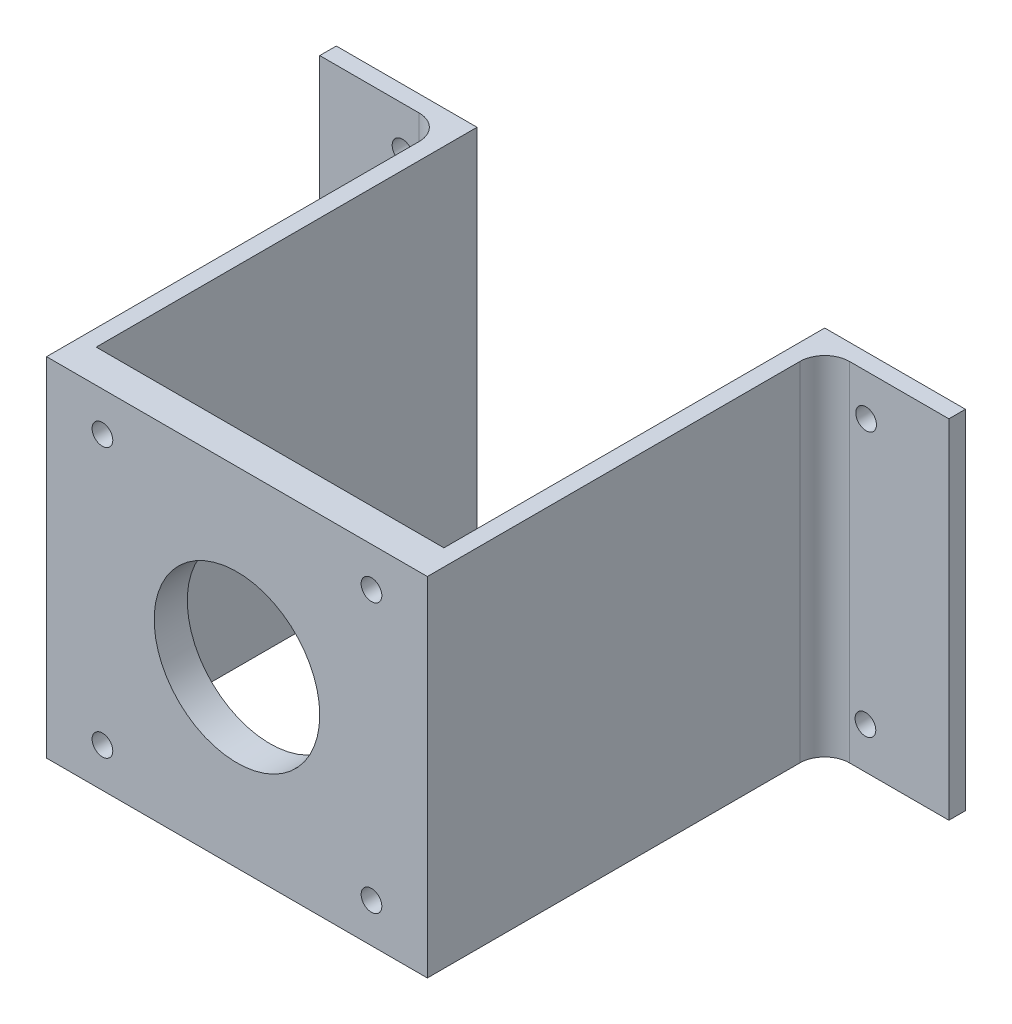
ISO-10303-21;
HEADER;
FILE_DESCRIPTION(('STEP AP214'),'2;1');
FILE_NAME('part.step','',(''),(''),'','','');
FILE_SCHEMA(('AUTOMOTIVE_DESIGN { 1 0 10303 214 1 1 1 1 }'));
ENDSEC;
DATA;
#1=APPLICATION_CONTEXT('core data for automotive mechanical design processes');
#2=APPLICATION_PROTOCOL_DEFINITION('international standard','automotive_design',2000,#1);
#3=PRODUCT_CONTEXT('',#1,'mechanical');
#4=PRODUCT('Part','Part','',(#3));
#5=PRODUCT_RELATED_PRODUCT_CATEGORY('part','',(#4));
#6=PRODUCT_DEFINITION_FORMATION('','',#4);
#7=PRODUCT_DEFINITION_CONTEXT('part definition',#1,'design');
#8=PRODUCT_DEFINITION('design','',#6,#7);
#9=PRODUCT_DEFINITION_SHAPE('','',#8);
#10=(LENGTH_UNIT() NAMED_UNIT(*) SI_UNIT(.MILLI.,.METRE.));
#11=(NAMED_UNIT(*) PLANE_ANGLE_UNIT() SI_UNIT($,.RADIAN.));
#12=(NAMED_UNIT(*) SI_UNIT($,.STERADIAN.) SOLID_ANGLE_UNIT());
#13=UNCERTAINTY_MEASURE_WITH_UNIT(LENGTH_MEASURE(1.E-05),#10,'distance_accuracy_value','');
#14=(GEOMETRIC_REPRESENTATION_CONTEXT(3) GLOBAL_UNCERTAINTY_ASSIGNED_CONTEXT((#13)) GLOBAL_UNIT_ASSIGNED_CONTEXT((#10,
#11,#12)) REPRESENTATION_CONTEXT('',''));
#15=CARTESIAN_POINT('',(0.,0.,0.));
#16=DIRECTION('',(0.,0.,1.));
#17=DIRECTION('',(1.,0.,0.));
#18=AXIS2_PLACEMENT_3D('',#15,#16,#17);
#19=CARTESIAN_POINT('',(-38.7497945939034,36.6203743665979,4.));
#20=DIRECTION('',(-1.,0.,0.));
#21=DIRECTION('',(0.,-1.,0.));
#22=AXIS2_PLACEMENT_3D('',#19,#20,#21);
#23=PLANE('',#22);
#24=DIRECTION('',(0.,0.,-1.));
#25=VECTOR('',#24,1.);
#26=CARTESIAN_POINT('',(-38.7497945939034,-5.37962563340208,4.));
#27=LINE('',#26,#25);
#28=CARTESIAN_POINT('',(-38.7497945939034,-5.37962563340208,4.));
#29=VERTEX_POINT('',#28);
#30=CARTESIAN_POINT('',(-38.7497945939034,-5.37962563340208,-41.));
#31=VERTEX_POINT('',#30);
#32=EDGE_CURVE('E268',#29,#31,#27,.T.);
#33=ORIENTED_EDGE('',*,*,#32,.T.);
#34=DIRECTION('',(0.,-1.,0.));
#35=VECTOR('',#34,1.);
#36=CARTESIAN_POINT('',(-38.7497945939034,36.6203743665979,-41.));
#37=LINE('',#36,#35);
#38=CARTESIAN_POINT('',(-38.7497945939034,36.6203743665979,-41.));
#39=VERTEX_POINT('',#38);
#40=EDGE_CURVE('E67',#31,#39,#37,.F.);
#41=ORIENTED_EDGE('',*,*,#40,.T.);
#42=DIRECTION('',(0.,0.,-1.));
#43=VECTOR('',#42,1.);
#44=CARTESIAN_POINT('',(-38.7497945939034,36.6203743665979,4.));
#45=LINE('',#44,#43);
#46=CARTESIAN_POINT('',(-38.7497945939034,36.6203743665979,4.));
#47=VERTEX_POINT('',#46);
#48=EDGE_CURVE('E285',#47,#39,#45,.T.);
#49=ORIENTED_EDGE('',*,*,#48,.F.);
#50=DIRECTION('',(0.,1.,0.));
#51=VECTOR('',#50,1.);
#52=CARTESIAN_POINT('',(-38.7497945939034,36.6203743665979,4.));
#53=LINE('',#52,#51);
#54=EDGE_CURVE('E254',#29,#47,#53,.T.);
#55=ORIENTED_EDGE('',*,*,#54,.F.);
#56=EDGE_LOOP('',(#33,#41,#49,#55));
#57=FACE_BOUND('',#56,.T.);
#58=ADVANCED_FACE('F45',(#57),#23,.F.);
#59=CARTESIAN_POINT('',(0.,0.,0.));
#60=DIRECTION('',(0.,0.,1.));
#61=DIRECTION('',(1.,0.,0.));
#62=AXIS2_PLACEMENT_3D('',#59,#60,#61);
#63=PLANE('',#62);
#64=CARTESIAN_POINT('',(-61.7497945939034,15.6203743665979,0.));
#65=DIRECTION('',(0.,0.,1.));
#66=DIRECTION('',(1.,0.,0.));
#67=AXIS2_PLACEMENT_3D('',#64,#65,#66);
#68=CIRCLE('',#67,10.);
#69=CARTESIAN_POINT('',(-51.7497945939034,15.6203743665979,0.));
#70=VERTEX_POINT('',#69);
#71=EDGE_CURVE('E442',#70,#70,#68,.T.);
#72=ORIENTED_EDGE('',*,*,#71,.T.);
#73=EDGE_LOOP('',(#72));
#74=FACE_BOUND('',#73,.T.);
#75=CARTESIAN_POINT('',(-45.4997945939034,-0.629625633402082,0.));
#76=DIRECTION('',(0.,0.,1.));
#77=DIRECTION('',(1.,0.,0.));
#78=AXIS2_PLACEMENT_3D('',#75,#76,#77);
#79=CIRCLE('',#78,1.25);
#80=CARTESIAN_POINT('',(-44.2497945939034,-0.629625633402082,0.));
#81=VERTEX_POINT('',#80);
#82=EDGE_CURVE('E469',#81,#81,#79,.T.);
#83=ORIENTED_EDGE('',*,*,#82,.T.);
#84=EDGE_LOOP('',(#83));
#85=FACE_BOUND('',#84,.T.);
#86=CARTESIAN_POINT('',(-45.4997945939034,31.8703743665979,0.));
#87=DIRECTION('',(0.,0.,1.));
#88=DIRECTION('',(1.,0.,0.));
#89=AXIS2_PLACEMENT_3D('',#86,#87,#88);
#90=CIRCLE('',#89,1.25);
#91=CARTESIAN_POINT('',(-44.2497945939034,31.8703743665979,0.));
#92=VERTEX_POINT('',#91);
#93=EDGE_CURVE('E175',#92,#92,#90,.T.);
#94=ORIENTED_EDGE('',*,*,#93,.T.);
#95=EDGE_LOOP('',(#94));
#96=FACE_BOUND('',#95,.T.);
#97=CARTESIAN_POINT('',(-77.9997945939034,-0.629625633402079,0.));
#98=DIRECTION('',(0.,0.,1.));
#99=DIRECTION('',(1.,0.,0.));
#100=AXIS2_PLACEMENT_3D('',#97,#98,#99);
#101=CIRCLE('',#100,1.25);
#102=CARTESIAN_POINT('',(-76.7497945939034,-0.629625633402079,0.));
#103=VERTEX_POINT('',#102);
#104=EDGE_CURVE('E179',#103,#103,#101,.T.);
#105=ORIENTED_EDGE('',*,*,#104,.T.);
#106=EDGE_LOOP('',(#105));
#107=FACE_BOUND('',#106,.T.);
#108=CARTESIAN_POINT('',(-77.9997945939034,31.8703743665979,0.));
#109=DIRECTION('',(0.,0.,1.));
#110=DIRECTION('',(1.,0.,0.));
#111=AXIS2_PLACEMENT_3D('',#108,#109,#110);
#112=CIRCLE('',#111,1.25);
#113=CARTESIAN_POINT('',(-76.7497945939034,31.8703743665979,0.));
#114=VERTEX_POINT('',#113);
#115=EDGE_CURVE('E478',#114,#114,#112,.T.);
#116=ORIENTED_EDGE('',*,*,#115,.T.);
#117=EDGE_LOOP('',(#116));
#118=FACE_BOUND('',#117,.T.);
#119=DIRECTION('',(0.,-1.,0.));
#120=VECTOR('',#119,1.);
#121=CARTESIAN_POINT('',(-82.7497945939034,36.6203743665979,0.));
#122=LINE('',#121,#120);
#123=CARTESIAN_POINT('',(-82.7497945939034,36.6203743665979,0.));
#124=VERTEX_POINT('',#123);
#125=CARTESIAN_POINT('',(-82.7497945939034,-5.37962563340208,0.));
#126=VERTEX_POINT('',#125);
#127=EDGE_CURVE('E222',#124,#126,#122,.T.);
#128=ORIENTED_EDGE('',*,*,#127,.F.);
#129=DIRECTION('',(-1.,0.,0.));
#130=VECTOR('',#129,1.);
#131=CARTESIAN_POINT('',(-84.7497945939034,36.6203743665979,0.));
#132=LINE('',#131,#130);
#133=CARTESIAN_POINT('',(-40.7497945939034,36.6203743665979,0.));
#134=VERTEX_POINT('',#133);
#135=EDGE_CURVE('E240',#134,#124,#132,.T.);
#136=ORIENTED_EDGE('',*,*,#135,.F.);
#137=DIRECTION('',(0.,1.,0.));
#138=VECTOR('',#137,1.);
#139=CARTESIAN_POINT('',(-40.7497945939034,36.6203743665979,0.));
#140=LINE('',#139,#138);
#141=CARTESIAN_POINT('',(-40.7497945939034,-5.37962563340208,0.));
#142=VERTEX_POINT('',#141);
#143=EDGE_CURVE('E232',#142,#134,#140,.T.);
#144=ORIENTED_EDGE('',*,*,#143,.F.);
#145=DIRECTION('',(1.,0.,0.));
#146=VECTOR('',#145,1.);
#147=CARTESIAN_POINT('',(-84.7497945939034,-5.37962563340208,0.));
#148=LINE('',#147,#146);
#149=EDGE_CURVE('E259',#126,#142,#148,.T.);
#150=ORIENTED_EDGE('',*,*,#149,.F.);
#151=EDGE_LOOP('',(#128,#136,#144,#150));
#152=FACE_BOUND('',#151,.T.);
#153=ADVANCED_FACE('F359',(#74,#85,#96,#107,#118,#152),#63,.F.);
#154=CARTESIAN_POINT('',(-84.7497945939034,36.6203743665979,4.));
#155=DIRECTION('',(0.,-1.,0.));
#156=DIRECTION('',(0.,0.,-1.));
#157=AXIS2_PLACEMENT_3D('',#154,#155,#156);
#158=PLANE('',#157);
#159=ORIENTED_EDGE('',*,*,#48,.T.);
#160=CARTESIAN_POINT('',(-35.7497945939034,36.6203743665979,-41.));
#161=DIRECTION('',(0.,-1.,0.));
#162=DIRECTION('',(0.,0.,-1.));
#163=AXIS2_PLACEMENT_3D('',#160,#161,#162);
#164=CIRCLE('',#163,3.);
#165=CARTESIAN_POINT('',(-35.7497945939034,36.6203743665979,-44.));
#166=VERTEX_POINT('',#165);
#167=EDGE_CURVE('E11',#39,#166,#164,.T.);
#168=ORIENTED_EDGE('',*,*,#167,.T.);
#169=DIRECTION('',(-1.,0.,0.));
#170=VECTOR('',#169,1.);
#171=CARTESIAN_POINT('',(-23.7497945939034,36.6203743665979,-44.));
#172=LINE('',#171,#170);
#173=CARTESIAN_POINT('',(-23.7497945939034,36.6203743665979,-44.));
#174=VERTEX_POINT('',#173);
#175=EDGE_CURVE('E164',#174,#166,#172,.T.);
#176=ORIENTED_EDGE('',*,*,#175,.F.);
#177=DIRECTION('',(0.,0.,1.));
#178=VECTOR('',#177,1.);
#179=CARTESIAN_POINT('',(-23.7497945939034,36.6203743665979,-46.));
#180=LINE('',#179,#178);
#181=CARTESIAN_POINT('',(-23.7497945939034,36.6203743665979,-46.));
#182=VERTEX_POINT('',#181);
#183=EDGE_CURVE('E161',#182,#174,#180,.T.);
#184=ORIENTED_EDGE('',*,*,#183,.F.);
#185=DIRECTION('',(1.,0.,0.));
#186=VECTOR('',#185,1.);
#187=CARTESIAN_POINT('',(-38.7497945939034,36.6203743665979,-46.));
#188=LINE('',#187,#186);
#189=CARTESIAN_POINT('',(-40.7497945939034,36.6203743665979,-46.));
#190=VERTEX_POINT('',#189);
#191=EDGE_CURVE('E147',#190,#182,#188,.T.);
#192=ORIENTED_EDGE('',*,*,#191,.F.);
#193=DIRECTION('',(0.,0.,1.));
#194=VECTOR('',#193,1.);
#195=CARTESIAN_POINT('',(-40.7497945939034,36.6203743665979,-46.));
#196=LINE('',#195,#194);
#197=EDGE_CURVE('E158',#190,#134,#196,.T.);
#198=ORIENTED_EDGE('',*,*,#197,.T.);
#199=ORIENTED_EDGE('',*,*,#135,.T.);
#200=DIRECTION('',(0.,0.,1.));
#201=VECTOR('',#200,1.);
#202=CARTESIAN_POINT('',(-82.7497945939034,36.6203743665979,-46.));
#203=LINE('',#202,#201);
#204=CARTESIAN_POINT('',(-82.7497945939034,36.6203743665979,-46.));
#205=VERTEX_POINT('',#204);
#206=EDGE_CURVE('E228',#205,#124,#203,.T.);
#207=ORIENTED_EDGE('',*,*,#206,.F.);
#208=DIRECTION('',(1.,0.,0.));
#209=VECTOR('',#208,1.);
#210=CARTESIAN_POINT('',(-82.7497945939034,36.6203743665979,-46.));
#211=LINE('',#210,#209);
#212=CARTESIAN_POINT('',(-99.7497945939034,36.6203743665979,-46.));
#213=VERTEX_POINT('',#212);
#214=EDGE_CURVE('E225',#213,#205,#211,.T.);
#215=ORIENTED_EDGE('',*,*,#214,.F.);
#216=DIRECTION('',(0.,0.,1.));
#217=VECTOR('',#216,1.);
#218=CARTESIAN_POINT('',(-99.7497945939034,36.6203743665979,-46.));
#219=LINE('',#218,#217);
#220=CARTESIAN_POINT('',(-99.7497945939034,36.6203743665979,-44.));
#221=VERTEX_POINT('',#220);
#222=EDGE_CURVE('E200',#213,#221,#219,.T.);
#223=ORIENTED_EDGE('',*,*,#222,.T.);
#224=DIRECTION('',(1.,0.,0.));
#225=VECTOR('',#224,1.);
#226=CARTESIAN_POINT('',(-99.7497945939034,36.6203743665979,-44.));
#227=LINE('',#226,#225);
#228=CARTESIAN_POINT('',(-87.7497945939034,36.6203743665979,-44.));
#229=VERTEX_POINT('',#228);
#230=EDGE_CURVE('E208',#221,#229,#227,.T.);
#231=ORIENTED_EDGE('',*,*,#230,.T.);
#232=CARTESIAN_POINT('',(-87.7497945939034,36.6203743665979,-41.));
#233=DIRECTION('',(0.,-1.,0.));
#234=DIRECTION('',(0.,0.,-1.));
#235=AXIS2_PLACEMENT_3D('',#232,#233,#234);
#236=CIRCLE('',#235,3.);
#237=CARTESIAN_POINT('',(-84.7497945939034,36.6203743665979,-41.));
#238=VERTEX_POINT('',#237);
#239=EDGE_CURVE('E298',#229,#238,#236,.T.);
#240=ORIENTED_EDGE('',*,*,#239,.T.);
#241=DIRECTION('',(0.,0.,-1.));
#242=VECTOR('',#241,1.);
#243=CARTESIAN_POINT('',(-84.7497945939034,36.6203743665979,4.));
#244=LINE('',#243,#242);
#245=CARTESIAN_POINT('',(-84.7497945939034,36.6203743665979,4.));
#246=VERTEX_POINT('',#245);
#247=EDGE_CURVE('E281',#246,#238,#244,.T.);
#248=ORIENTED_EDGE('',*,*,#247,.F.);
#249=DIRECTION('',(-1.,0.,0.));
#250=VECTOR('',#249,1.);
#251=CARTESIAN_POINT('',(-84.7497945939034,36.6203743665979,4.));
#252=LINE('',#251,#250);
#253=EDGE_CURVE('E258',#47,#246,#252,.T.);
#254=ORIENTED_EDGE('',*,*,#253,.F.);
#255=EDGE_LOOP('',(#159,#168,#176,#184,#192,#198,#199,#207,#215,#223,#231,#240,#248,#254));
#256=FACE_BOUND('',#255,.T.);
#257=ADVANCED_FACE('F162',(#256),#158,.F.);
#258=CARTESIAN_POINT('',(-84.7497945939034,36.6203743665979,4.));
#259=DIRECTION('',(1.,0.,0.));
#260=DIRECTION('',(0.,0.,-1.));
#261=AXIS2_PLACEMENT_3D('',#258,#259,#260);
#262=PLANE('',#261);
#263=ORIENTED_EDGE('',*,*,#247,.T.);
#264=DIRECTION('',(0.,-1.,0.));
#265=VECTOR('',#264,1.);
#266=CARTESIAN_POINT('',(-84.7497945939034,36.6203743665979,-41.));
#267=LINE('',#266,#265);
#268=CARTESIAN_POINT('',(-84.7497945939034,-5.37962563340208,-41.));
#269=VERTEX_POINT('',#268);
#270=EDGE_CURVE('E288',#238,#269,#267,.T.);
#271=ORIENTED_EDGE('',*,*,#270,.T.);
#272=DIRECTION('',(0.,0.,-1.));
#273=VECTOR('',#272,1.);
#274=CARTESIAN_POINT('',(-84.7497945939034,-5.37962563340208,4.));
#275=LINE('',#274,#273);
#276=CARTESIAN_POINT('',(-84.7497945939034,-5.37962563340208,4.));
#277=VERTEX_POINT('',#276);
#278=EDGE_CURVE('E277',#277,#269,#275,.T.);
#279=ORIENTED_EDGE('',*,*,#278,.F.);
#280=DIRECTION('',(0.,-1.,0.));
#281=VECTOR('',#280,1.);
#282=CARTESIAN_POINT('',(-84.7497945939034,36.6203743665979,4.));
#283=LINE('',#282,#281);
#284=EDGE_CURVE('E262',#246,#277,#283,.T.);
#285=ORIENTED_EDGE('',*,*,#284,.F.);
#286=EDGE_LOOP('',(#263,#271,#279,#285));
#287=FACE_BOUND('',#286,.T.);
#288=ADVANCED_FACE('F341',(#287),#262,.F.);
#289=CARTESIAN_POINT('',(-84.7497945939034,-5.37962563340208,4.));
#290=DIRECTION('',(0.,1.,0.));
#291=DIRECTION('',(0.,0.,1.));
#292=AXIS2_PLACEMENT_3D('',#289,#290,#291);
#293=PLANE('',#292);
#294=ORIENTED_EDGE('',*,*,#278,.T.);
#295=CARTESIAN_POINT('',(-87.7497945939034,-5.37962563340208,-41.));
#296=DIRECTION('',(0.,1.,0.));
#297=DIRECTION('',(0.,0.,1.));
#298=AXIS2_PLACEMENT_3D('',#295,#296,#297);
#299=CIRCLE('',#298,3.);
#300=CARTESIAN_POINT('',(-87.7497945939034,-5.37962563340208,-44.));
#301=VERTEX_POINT('',#300);
#302=EDGE_CURVE('E295',#269,#301,#299,.T.);
#303=ORIENTED_EDGE('',*,*,#302,.T.);
#304=DIRECTION('',(1.,0.,0.));
#305=VECTOR('',#304,1.);
#306=CARTESIAN_POINT('',(-99.7497945939034,-5.37962563340208,-44.));
#307=LINE('',#306,#305);
#308=CARTESIAN_POINT('',(-99.7497945939034,-5.37962563340208,-44.));
#309=VERTEX_POINT('',#308);
#310=EDGE_CURVE('E209',#309,#301,#307,.T.);
#311=ORIENTED_EDGE('',*,*,#310,.F.);
#312=DIRECTION('',(0.,0.,-1.));
#313=VECTOR('',#312,1.);
#314=CARTESIAN_POINT('',(-99.7497945939034,-5.37962563340208,-44.));
#315=LINE('',#314,#313);
#316=CARTESIAN_POINT('',(-99.7497945939034,-5.37962563340208,-46.));
#317=VERTEX_POINT('',#316);
#318=EDGE_CURVE('E192',#309,#317,#315,.T.);
#319=ORIENTED_EDGE('',*,*,#318,.T.);
#320=DIRECTION('',(-1.,0.,0.));
#321=VECTOR('',#320,1.);
#322=CARTESIAN_POINT('',(-82.7497945939034,-5.37962563340208,-46.));
#323=LINE('',#322,#321);
#324=CARTESIAN_POINT('',(-82.7497945939034,-5.37962563340208,-46.));
#325=VERTEX_POINT('',#324);
#326=EDGE_CURVE('E221',#325,#317,#323,.T.);
#327=ORIENTED_EDGE('',*,*,#326,.F.);
#328=DIRECTION('',(0.,0.,1.));
#329=VECTOR('',#328,1.);
#330=CARTESIAN_POINT('',(-82.7497945939034,-5.37962563340208,-46.));
#331=LINE('',#330,#329);
#332=EDGE_CURVE('E236',#325,#126,#331,.T.);
#333=ORIENTED_EDGE('',*,*,#332,.T.);
#334=ORIENTED_EDGE('',*,*,#149,.T.);
#335=DIRECTION('',(0.,0.,1.));
#336=VECTOR('',#335,1.);
#337=CARTESIAN_POINT('',(-40.7497945939034,-5.37962563340208,-46.));
#338=LINE('',#337,#336);
#339=CARTESIAN_POINT('',(-40.7497945939034,-5.37962563340208,-46.));
#340=VERTEX_POINT('',#339);
#341=EDGE_CURVE('E213',#340,#142,#338,.T.);
#342=ORIENTED_EDGE('',*,*,#341,.F.);
#343=DIRECTION('',(-1.,0.,0.));
#344=VECTOR('',#343,1.);
#345=CARTESIAN_POINT('',(-38.7497945939034,-5.37962563340208,-46.));
#346=LINE('',#345,#344);
#347=CARTESIAN_POINT('',(-23.7497945939034,-5.37962563340208,-46.));
#348=VERTEX_POINT('',#347);
#349=EDGE_CURVE('E248',#348,#340,#346,.T.);
#350=ORIENTED_EDGE('',*,*,#349,.F.);
#351=DIRECTION('',(0.,0.,-1.));
#352=VECTOR('',#351,1.);
#353=CARTESIAN_POINT('',(-23.7497945939034,-5.37962563340208,-44.));
#354=LINE('',#353,#352);
#355=CARTESIAN_POINT('',(-23.7497945939034,-5.37962563340208,-44.));
#356=VERTEX_POINT('',#355);
#357=EDGE_CURVE('E173',#356,#348,#354,.T.);
#358=ORIENTED_EDGE('',*,*,#357,.F.);
#359=DIRECTION('',(-1.,0.,0.));
#360=VECTOR('',#359,1.);
#361=CARTESIAN_POINT('',(-23.7497945939034,-5.37962563340208,-44.));
#362=LINE('',#361,#360);
#363=CARTESIAN_POINT('',(-35.7497945939034,-5.37962563340208,-44.));
#364=VERTEX_POINT('',#363);
#365=EDGE_CURVE('E187',#356,#364,#362,.T.);
#366=ORIENTED_EDGE('',*,*,#365,.T.);
#367=CARTESIAN_POINT('',(-35.7497945939034,-5.37962563340208,-41.));
#368=DIRECTION('',(0.,1.,0.));
#369=DIRECTION('',(0.,0.,1.));
#370=AXIS2_PLACEMENT_3D('',#367,#368,#369);
#371=CIRCLE('',#370,3.);
#372=EDGE_CURVE('E54',#364,#31,#371,.T.);
#373=ORIENTED_EDGE('',*,*,#372,.T.);
#374=ORIENTED_EDGE('',*,*,#32,.F.);
#375=DIRECTION('',(1.,0.,0.));
#376=VECTOR('',#375,1.);
#377=CARTESIAN_POINT('',(-84.7497945939034,-5.37962563340208,4.));
#378=LINE('',#377,#376);
#379=EDGE_CURVE('E265',#277,#29,#378,.T.);
#380=ORIENTED_EDGE('',*,*,#379,.F.);
#381=EDGE_LOOP('',(#294,#303,#311,#319,#327,#333,#334,#342,#350,#358,#366,#373,#374,#380));
#382=FACE_BOUND('',#381,.T.);
#383=ADVANCED_FACE('F313',(#382),#293,.F.);
#384=CARTESIAN_POINT('',(0.,0.,4.));
#385=DIRECTION('',(0.,0.,1.));
#386=DIRECTION('',(1.,0.,0.));
#387=AXIS2_PLACEMENT_3D('',#384,#385,#386);
#388=PLANE('',#387);
#389=CARTESIAN_POINT('',(-61.7497945939034,15.6203743665979,4.));
#390=DIRECTION('',(0.,0.,1.));
#391=DIRECTION('',(1.,0.,0.));
#392=AXIS2_PLACEMENT_3D('',#389,#390,#391);
#393=CIRCLE('',#392,10.);
#394=CARTESIAN_POINT('',(-51.7497945939034,15.6203743665979,4.));
#395=VERTEX_POINT('',#394);
#396=EDGE_CURVE('E525',#395,#395,#393,.T.);
#397=ORIENTED_EDGE('',*,*,#396,.F.);
#398=EDGE_LOOP('',(#397));
#399=FACE_BOUND('',#398,.T.);
#400=CARTESIAN_POINT('',(-45.4997945939034,-0.629625633402082,4.));
#401=DIRECTION('',(0.,0.,1.));
#402=DIRECTION('',(1.,0.,0.));
#403=AXIS2_PLACEMENT_3D('',#400,#401,#402);
#404=CIRCLE('',#403,1.25);
#405=CARTESIAN_POINT('',(-44.2497945939034,-0.629625633402082,4.));
#406=VERTEX_POINT('',#405);
#407=EDGE_CURVE('E465',#406,#406,#404,.T.);
#408=ORIENTED_EDGE('',*,*,#407,.F.);
#409=EDGE_LOOP('',(#408));
#410=FACE_BOUND('',#409,.T.);
#411=CARTESIAN_POINT('',(-45.4997945939034,31.8703743665979,4.));
#412=DIRECTION('',(0.,0.,1.));
#413=DIRECTION('',(1.,0.,0.));
#414=AXIS2_PLACEMENT_3D('',#411,#412,#413);
#415=CIRCLE('',#414,1.25);
#416=CARTESIAN_POINT('',(-44.2497945939034,31.8703743665979,4.));
#417=VERTEX_POINT('',#416);
#418=EDGE_CURVE('E474',#417,#417,#415,.T.);
#419=ORIENTED_EDGE('',*,*,#418,.F.);
#420=EDGE_LOOP('',(#419));
#421=FACE_BOUND('',#420,.T.);
#422=CARTESIAN_POINT('',(-77.9997945939034,-0.629625633402079,4.));
#423=DIRECTION('',(0.,0.,1.));
#424=DIRECTION('',(1.,0.,0.));
#425=AXIS2_PLACEMENT_3D('',#422,#423,#424);
#426=CIRCLE('',#425,1.25);
#427=CARTESIAN_POINT('',(-76.7497945939034,-0.629625633402079,4.));
#428=VERTEX_POINT('',#427);
#429=EDGE_CURVE('E479',#428,#428,#426,.T.);
#430=ORIENTED_EDGE('',*,*,#429,.F.);
#431=EDGE_LOOP('',(#430));
#432=FACE_BOUND('',#431,.T.);
#433=CARTESIAN_POINT('',(-77.9997945939034,31.8703743665979,4.));
#434=DIRECTION('',(0.,0.,1.));
#435=DIRECTION('',(1.,0.,0.));
#436=AXIS2_PLACEMENT_3D('',#433,#434,#435);
#437=CIRCLE('',#436,1.25);
#438=CARTESIAN_POINT('',(-76.7497945939034,31.8703743665979,4.));
#439=VERTEX_POINT('',#438);
#440=EDGE_CURVE('E473',#439,#439,#437,.T.);
#441=ORIENTED_EDGE('',*,*,#440,.F.);
#442=EDGE_LOOP('',(#441));
#443=FACE_BOUND('',#442,.T.);
#444=ORIENTED_EDGE('',*,*,#54,.T.);
#445=ORIENTED_EDGE('',*,*,#253,.T.);
#446=ORIENTED_EDGE('',*,*,#284,.T.);
#447=ORIENTED_EDGE('',*,*,#379,.T.);
#448=EDGE_LOOP('',(#444,#445,#446,#447));
#449=FACE_BOUND('',#448,.T.);
#450=ADVANCED_FACE('F346',(#399,#410,#421,#432,#443,#449),#388,.T.);
#451=CARTESIAN_POINT('',(-40.7497945939034,36.6203743665979,-46.));
#452=DIRECTION('',(1.,0.,0.));
#453=DIRECTION('',(0.,0.,-1.));
#454=AXIS2_PLACEMENT_3D('',#451,#452,#453);
#455=PLANE('',#454);
#456=ORIENTED_EDGE('',*,*,#143,.T.);
#457=ORIENTED_EDGE('',*,*,#197,.F.);
#458=DIRECTION('',(0.,1.,0.));
#459=VECTOR('',#458,1.);
#460=CARTESIAN_POINT('',(-40.7497945939034,36.6203743665979,-46.));
#461=LINE('',#460,#459);
#462=EDGE_CURVE('E153',#340,#190,#461,.T.);
#463=ORIENTED_EDGE('',*,*,#462,.F.);
#464=ORIENTED_EDGE('',*,*,#341,.T.);
#465=EDGE_LOOP('',(#456,#457,#463,#464));
#466=FACE_BOUND('',#465,.T.);
#467=ADVANCED_FACE('F316',(#466),#455,.F.);
#468=CARTESIAN_POINT('',(0.,0.,-46.));
#469=DIRECTION('',(0.,0.,-1.));
#470=DIRECTION('',(-1.,0.,0.));
#471=AXIS2_PLACEMENT_3D('',#468,#469,#470);
#472=PLANE('',#471);
#473=CARTESIAN_POINT('',(-33.8298981458636,-0.379625633402073,-46.));
#474=DIRECTION('',(0.,0.,-1.));
#475=DIRECTION('',(-1.,0.,0.));
#476=AXIS2_PLACEMENT_3D('',#473,#474,#475);
#477=CIRCLE('',#476,1.25);
#478=CARTESIAN_POINT('',(-35.0798981458636,-0.379625633402073,-46.));
#479=VERTEX_POINT('',#478);
#480=EDGE_CURVE('E461',#479,#479,#477,.T.);
#481=ORIENTED_EDGE('',*,*,#480,.F.);
#482=EDGE_LOOP('',(#481));
#483=FACE_BOUND('',#482,.T.);
#484=CARTESIAN_POINT('',(-33.7497945939034,31.6203743665979,-46.));
#485=DIRECTION('',(0.,0.,-1.));
#486=DIRECTION('',(-1.,0.,0.));
#487=AXIS2_PLACEMENT_3D('',#484,#485,#486);
#488=CIRCLE('',#487,1.25);
#489=CARTESIAN_POINT('',(-34.9997945939034,31.6203743665979,-46.));
#490=VERTEX_POINT('',#489);
#491=EDGE_CURVE('E454',#490,#490,#488,.T.);
#492=ORIENTED_EDGE('',*,*,#491,.F.);
#493=EDGE_LOOP('',(#492));
#494=FACE_BOUND('',#493,.T.);
#495=ORIENTED_EDGE('',*,*,#191,.T.);
#496=DIRECTION('',(0.,1.,0.));
#497=VECTOR('',#496,1.);
#498=CARTESIAN_POINT('',(-23.7497945939034,-5.37962563340208,-46.));
#499=LINE('',#498,#497);
#500=EDGE_CURVE('E151',#348,#182,#499,.T.);
#501=ORIENTED_EDGE('',*,*,#500,.F.);
#502=ORIENTED_EDGE('',*,*,#349,.T.);
#503=ORIENTED_EDGE('',*,*,#462,.T.);
#504=EDGE_LOOP('',(#495,#501,#502,#503));
#505=FACE_BOUND('',#504,.T.);
#506=ADVANCED_FACE('F149',(#483,#494,#505),#472,.T.);
#507=CARTESIAN_POINT('',(-82.7497945939034,36.6203743665979,-46.));
#508=DIRECTION('',(-1.,0.,0.));
#509=DIRECTION('',(0.,0.,1.));
#510=AXIS2_PLACEMENT_3D('',#507,#508,#509);
#511=PLANE('',#510);
#512=ORIENTED_EDGE('',*,*,#127,.T.);
#513=ORIENTED_EDGE('',*,*,#332,.F.);
#514=DIRECTION('',(0.,-1.,0.));
#515=VECTOR('',#514,1.);
#516=CARTESIAN_POINT('',(-82.7497945939034,36.6203743665979,-46.));
#517=LINE('',#516,#515);
#518=EDGE_CURVE('E217',#205,#325,#517,.T.);
#519=ORIENTED_EDGE('',*,*,#518,.F.);
#520=ORIENTED_EDGE('',*,*,#206,.T.);
#521=EDGE_LOOP('',(#512,#513,#519,#520));
#522=FACE_BOUND('',#521,.T.);
#523=ADVANCED_FACE('F321',(#522),#511,.F.);
#524=CARTESIAN_POINT('',(0.,0.,-46.));
#525=DIRECTION('',(0.,0.,-1.));
#526=DIRECTION('',(-1.,0.,0.));
#527=AXIS2_PLACEMENT_3D('',#524,#525,#526);
#528=PLANE('',#527);
#529=CARTESIAN_POINT('',(-89.6696910419431,-0.379625633402073,-46.));
#530=DIRECTION('',(0.,0.,-1.));
#531=DIRECTION('',(-1.,0.,0.));
#532=AXIS2_PLACEMENT_3D('',#529,#530,#531);
#533=CIRCLE('',#532,1.25);
#534=CARTESIAN_POINT('',(-90.9196910419431,-0.379625633402073,-46.));
#535=VERTEX_POINT('',#534);
#536=EDGE_CURVE('E429',#535,#535,#533,.F.);
#537=ORIENTED_EDGE('',*,*,#536,.T.);
#538=EDGE_LOOP('',(#537));
#539=FACE_BOUND('',#538,.T.);
#540=CARTESIAN_POINT('',(-89.7497945939034,31.6203743665979,-46.));
#541=DIRECTION('',(0.,0.,-1.));
#542=DIRECTION('',(-1.,0.,0.));
#543=AXIS2_PLACEMENT_3D('',#540,#541,#542);
#544=CIRCLE('',#543,1.25);
#545=CARTESIAN_POINT('',(-90.9997945939034,31.6203743665979,-46.));
#546=VERTEX_POINT('',#545);
#547=EDGE_CURVE('E434',#546,#546,#544,.F.);
#548=ORIENTED_EDGE('',*,*,#547,.T.);
#549=EDGE_LOOP('',(#548));
#550=FACE_BOUND('',#549,.T.);
#551=ORIENTED_EDGE('',*,*,#518,.T.);
#552=ORIENTED_EDGE('',*,*,#326,.T.);
#553=DIRECTION('',(0.,1.,0.));
#554=VECTOR('',#553,1.);
#555=CARTESIAN_POINT('',(-99.7497945939034,-5.37962563340208,-46.));
#556=LINE('',#555,#554);
#557=EDGE_CURVE('E196',#317,#213,#556,.T.);
#558=ORIENTED_EDGE('',*,*,#557,.T.);
#559=ORIENTED_EDGE('',*,*,#214,.T.);
#560=EDGE_LOOP('',(#551,#552,#558,#559));
#561=FACE_BOUND('',#560,.T.);
#562=ADVANCED_FACE('F324',(#539,#550,#561),#528,.T.);
#563=CARTESIAN_POINT('',(-99.7497945939034,36.6203743665979,-44.));
#564=DIRECTION('',(0.,0.,1.));
#565=DIRECTION('',(1.,0.,0.));
#566=AXIS2_PLACEMENT_3D('',#563,#564,#565);
#567=PLANE('',#566);
#568=CARTESIAN_POINT('',(-89.6696910419431,-0.379625633402073,-44.));
#569=DIRECTION('',(0.,0.,-1.));
#570=DIRECTION('',(-1.,0.,0.));
#571=AXIS2_PLACEMENT_3D('',#568,#569,#570);
#572=CIRCLE('',#571,1.25);
#573=CARTESIAN_POINT('',(-90.9196910419431,-0.379625633402073,-44.));
#574=VERTEX_POINT('',#573);
#575=EDGE_CURVE('E432',#574,#574,#572,.T.);
#576=ORIENTED_EDGE('',*,*,#575,.T.);
#577=EDGE_LOOP('',(#576));
#578=FACE_BOUND('',#577,.T.);
#579=CARTESIAN_POINT('',(-89.7497945939034,31.6203743665979,-44.));
#580=DIRECTION('',(0.,0.,-1.));
#581=DIRECTION('',(-1.,0.,0.));
#582=AXIS2_PLACEMENT_3D('',#579,#580,#581);
#583=CIRCLE('',#582,1.25);
#584=CARTESIAN_POINT('',(-90.9997945939034,31.6203743665979,-44.));
#585=VERTEX_POINT('',#584);
#586=EDGE_CURVE('E435',#585,#585,#583,.T.);
#587=ORIENTED_EDGE('',*,*,#586,.T.);
#588=EDGE_LOOP('',(#587));
#589=FACE_BOUND('',#588,.T.);
#590=ORIENTED_EDGE('',*,*,#310,.T.);
#591=DIRECTION('',(0.,-1.,0.));
#592=VECTOR('',#591,1.);
#593=CARTESIAN_POINT('',(-87.7497945939034,36.6203743665979,-44.));
#594=LINE('',#593,#592);
#595=EDGE_CURVE('E292',#301,#229,#594,.F.);
#596=ORIENTED_EDGE('',*,*,#595,.T.);
#597=ORIENTED_EDGE('',*,*,#230,.F.);
#598=DIRECTION('',(0.,-1.,0.));
#599=VECTOR('',#598,1.);
#600=CARTESIAN_POINT('',(-99.7497945939034,36.6203743665979,-44.));
#601=LINE('',#600,#599);
#602=EDGE_CURVE('E204',#221,#309,#601,.T.);
#603=ORIENTED_EDGE('',*,*,#602,.T.);
#604=EDGE_LOOP('',(#590,#596,#597,#603));
#605=FACE_BOUND('',#604,.T.);
#606=ADVANCED_FACE('F332',(#578,#589,#605),#567,.T.);
#607=CARTESIAN_POINT('',(-99.7497945939034,0.,0.));
#608=DIRECTION('',(1.,0.,0.));
#609=DIRECTION('',(0.,0.,-1.));
#610=AXIS2_PLACEMENT_3D('',#607,#608,#609);
#611=PLANE('',#610);
#612=ORIENTED_EDGE('',*,*,#318,.F.);
#613=ORIENTED_EDGE('',*,*,#602,.F.);
#614=ORIENTED_EDGE('',*,*,#222,.F.);
#615=ORIENTED_EDGE('',*,*,#557,.F.);
#616=EDGE_LOOP('',(#612,#613,#614,#615));
#617=FACE_BOUND('',#616,.T.);
#618=ADVANCED_FACE('F330',(#617),#611,.F.);
#619=CARTESIAN_POINT('',(-23.7497945939034,36.6203743665979,-44.));
#620=DIRECTION('',(0.,0.,-1.));
#621=DIRECTION('',(-1.,0.,0.));
#622=AXIS2_PLACEMENT_3D('',#619,#620,#621);
#623=PLANE('',#622);
#624=CARTESIAN_POINT('',(-33.8298981458636,-0.379625633402073,-44.));
#625=DIRECTION('',(0.,0.,1.));
#626=DIRECTION('',(1.,0.,0.));
#627=AXIS2_PLACEMENT_3D('',#624,#625,#626);
#628=CIRCLE('',#627,1.25);
#629=CARTESIAN_POINT('',(-32.5798981458636,-0.379625633402073,-44.));
#630=VERTEX_POINT('',#629);
#631=EDGE_CURVE('E450',#630,#630,#628,.T.);
#632=ORIENTED_EDGE('',*,*,#631,.F.);
#633=EDGE_LOOP('',(#632));
#634=FACE_BOUND('',#633,.T.);
#635=CARTESIAN_POINT('',(-33.7497945939034,31.6203743665979,-44.));
#636=DIRECTION('',(0.,0.,1.));
#637=DIRECTION('',(1.,0.,0.));
#638=AXIS2_PLACEMENT_3D('',#635,#636,#637);
#639=CIRCLE('',#638,1.25);
#640=CARTESIAN_POINT('',(-32.4997945939034,31.6203743665979,-44.));
#641=VERTEX_POINT('',#640);
#642=EDGE_CURVE('E449',#641,#641,#639,.T.);
#643=ORIENTED_EDGE('',*,*,#642,.F.);
#644=EDGE_LOOP('',(#643));
#645=FACE_BOUND('',#644,.T.);
#646=ORIENTED_EDGE('',*,*,#175,.T.);
#647=DIRECTION('',(0.,-1.,0.));
#648=VECTOR('',#647,1.);
#649=CARTESIAN_POINT('',(-35.7497945939034,-5.37962563340208,-44.));
#650=LINE('',#649,#648);
#651=EDGE_CURVE('E301',#166,#364,#650,.T.);
#652=ORIENTED_EDGE('',*,*,#651,.T.);
#653=ORIENTED_EDGE('',*,*,#365,.F.);
#654=DIRECTION('',(0.,-1.,0.));
#655=VECTOR('',#654,1.);
#656=CARTESIAN_POINT('',(-23.7497945939034,36.6203743665979,-44.));
#657=LINE('',#656,#655);
#658=EDGE_CURVE('E168',#174,#356,#657,.T.);
#659=ORIENTED_EDGE('',*,*,#658,.F.);
#660=EDGE_LOOP('',(#646,#652,#653,#659));
#661=FACE_BOUND('',#660,.T.);
#662=ADVANCED_FACE('F310',(#634,#645,#661),#623,.F.);
#663=CARTESIAN_POINT('',(-23.7497945939034,0.,0.));
#664=DIRECTION('',(1.,0.,0.));
#665=DIRECTION('',(0.,1.,0.));
#666=AXIS2_PLACEMENT_3D('',#663,#664,#665);
#667=PLANE('',#666);
#668=ORIENTED_EDGE('',*,*,#500,.T.);
#669=ORIENTED_EDGE('',*,*,#183,.T.);
#670=ORIENTED_EDGE('',*,*,#658,.T.);
#671=ORIENTED_EDGE('',*,*,#357,.T.);
#672=EDGE_LOOP('',(#668,#669,#670,#671));
#673=FACE_BOUND('',#672,.T.);
#674=ADVANCED_FACE('F171',(#673),#667,.T.);
#675=CARTESIAN_POINT('',(-77.9997945939034,31.8703743665979,-11.));
#676=DIRECTION('',(0.,0.,1.));
#677=DIRECTION('',(1.,0.,0.));
#678=AXIS2_PLACEMENT_3D('',#675,#676,#677);
#679=CYLINDRICAL_SURFACE('',#678,1.25);
#680=ORIENTED_EDGE('',*,*,#440,.T.);
#681=EDGE_LOOP('',(#680));
#682=FACE_BOUND('',#681,.T.);
#683=ORIENTED_EDGE('',*,*,#115,.F.);
#684=EDGE_LOOP('',(#683));
#685=FACE_BOUND('',#684,.T.);
#686=ADVANCED_FACE('F394',(#682,#685),#679,.F.);
#687=CARTESIAN_POINT('',(-77.9997945939034,-0.629625633402079,-11.));
#688=DIRECTION('',(0.,0.,1.));
#689=DIRECTION('',(1.,0.,0.));
#690=AXIS2_PLACEMENT_3D('',#687,#688,#689);
#691=CYLINDRICAL_SURFACE('',#690,1.25);
#692=ORIENTED_EDGE('',*,*,#429,.T.);
#693=EDGE_LOOP('',(#692));
#694=FACE_BOUND('',#693,.T.);
#695=ORIENTED_EDGE('',*,*,#104,.F.);
#696=EDGE_LOOP('',(#695));
#697=FACE_BOUND('',#696,.T.);
#698=ADVANCED_FACE('F397',(#694,#697),#691,.F.);
#699=CARTESIAN_POINT('',(-45.4997945939034,31.8703743665979,-11.));
#700=DIRECTION('',(0.,0.,1.));
#701=DIRECTION('',(1.,0.,0.));
#702=AXIS2_PLACEMENT_3D('',#699,#700,#701);
#703=CYLINDRICAL_SURFACE('',#702,1.25);
#704=ORIENTED_EDGE('',*,*,#418,.T.);
#705=EDGE_LOOP('',(#704));
#706=FACE_BOUND('',#705,.T.);
#707=ORIENTED_EDGE('',*,*,#93,.F.);
#708=EDGE_LOOP('',(#707));
#709=FACE_BOUND('',#708,.T.);
#710=ADVANCED_FACE('F401',(#706,#709),#703,.F.);
#711=CARTESIAN_POINT('',(-45.4997945939034,-0.629625633402082,-11.));
#712=DIRECTION('',(0.,0.,1.));
#713=DIRECTION('',(1.,0.,0.));
#714=AXIS2_PLACEMENT_3D('',#711,#712,#713);
#715=CYLINDRICAL_SURFACE('',#714,1.25);
#716=ORIENTED_EDGE('',*,*,#407,.T.);
#717=EDGE_LOOP('',(#716));
#718=FACE_BOUND('',#717,.T.);
#719=ORIENTED_EDGE('',*,*,#82,.F.);
#720=EDGE_LOOP('',(#719));
#721=FACE_BOUND('',#720,.T.);
#722=ADVANCED_FACE('F405',(#718,#721),#715,.F.);
#723=CARTESIAN_POINT('',(-33.7497945939034,31.6203743665979,-59.));
#724=DIRECTION('',(0.,0.,1.));
#725=DIRECTION('',(1.,0.,0.));
#726=AXIS2_PLACEMENT_3D('',#723,#724,#725);
#727=CYLINDRICAL_SURFACE('',#726,1.25);
#728=ORIENTED_EDGE('',*,*,#491,.T.);
#729=EDGE_LOOP('',(#728));
#730=FACE_BOUND('',#729,.T.);
#731=ORIENTED_EDGE('',*,*,#642,.T.);
#732=EDGE_LOOP('',(#731));
#733=FACE_BOUND('',#732,.T.);
#734=ADVANCED_FACE('F409',(#730,#733),#727,.F.);
#735=CARTESIAN_POINT('',(-33.8298981458636,-0.379625633402073,-59.));
#736=DIRECTION('',(0.,0.,1.));
#737=DIRECTION('',(1.,0.,0.));
#738=AXIS2_PLACEMENT_3D('',#735,#736,#737);
#739=CYLINDRICAL_SURFACE('',#738,1.25);
#740=ORIENTED_EDGE('',*,*,#480,.T.);
#741=EDGE_LOOP('',(#740));
#742=FACE_BOUND('',#741,.T.);
#743=ORIENTED_EDGE('',*,*,#631,.T.);
#744=EDGE_LOOP('',(#743));
#745=FACE_BOUND('',#744,.T.);
#746=ADVANCED_FACE('F413',(#742,#745),#739,.F.);
#747=CARTESIAN_POINT('',(-89.7497945939034,31.6203743665979,-59.));
#748=DIRECTION('',(0.,0.,1.));
#749=DIRECTION('',(1.,0.,0.));
#750=AXIS2_PLACEMENT_3D('',#747,#748,#749);
#751=CYLINDRICAL_SURFACE('',#750,1.25);
#752=ORIENTED_EDGE('',*,*,#547,.F.);
#753=EDGE_LOOP('',(#752));
#754=FACE_BOUND('',#753,.T.);
#755=ORIENTED_EDGE('',*,*,#586,.F.);
#756=EDGE_LOOP('',(#755));
#757=FACE_BOUND('',#756,.T.);
#758=ADVANCED_FACE('F417',(#754,#757),#751,.F.);
#759=CARTESIAN_POINT('',(-89.6696910419431,-0.379625633402073,-59.));
#760=DIRECTION('',(0.,0.,1.));
#761=DIRECTION('',(1.,0.,0.));
#762=AXIS2_PLACEMENT_3D('',#759,#760,#761);
#763=CYLINDRICAL_SURFACE('',#762,1.25);
#764=ORIENTED_EDGE('',*,*,#536,.F.);
#765=EDGE_LOOP('',(#764));
#766=FACE_BOUND('',#765,.T.);
#767=ORIENTED_EDGE('',*,*,#575,.F.);
#768=EDGE_LOOP('',(#767));
#769=FACE_BOUND('',#768,.T.);
#770=ADVANCED_FACE('F357',(#766,#769),#763,.F.);
#771=CARTESIAN_POINT('',(-87.7497945939034,36.6203743665979,-41.));
#772=DIRECTION('',(0.,-1.,0.));
#773=DIRECTION('',(0.,0.,-1.));
#774=AXIS2_PLACEMENT_3D('',#771,#772,#773);
#775=CYLINDRICAL_SURFACE('',#774,3.);
#776=ORIENTED_EDGE('',*,*,#239,.F.);
#777=ORIENTED_EDGE('',*,*,#595,.F.);
#778=ORIENTED_EDGE('',*,*,#302,.F.);
#779=ORIENTED_EDGE('',*,*,#270,.F.);
#780=EDGE_LOOP('',(#776,#777,#778,#779));
#781=FACE_BOUND('',#780,.T.);
#782=ADVANCED_FACE('F338',(#781),#775,.F.);
#783=CARTESIAN_POINT('',(-35.7497945939034,36.6203743665979,-41.));
#784=DIRECTION('',(0.,1.,0.));
#785=DIRECTION('',(-1.,0.,0.));
#786=AXIS2_PLACEMENT_3D('',#783,#784,#785);
#787=CYLINDRICAL_SURFACE('',#786,3.);
#788=ORIENTED_EDGE('',*,*,#167,.F.);
#789=ORIENTED_EDGE('',*,*,#40,.F.);
#790=ORIENTED_EDGE('',*,*,#372,.F.);
#791=ORIENTED_EDGE('',*,*,#651,.F.);
#792=EDGE_LOOP('',(#788,#789,#790,#791));
#793=FACE_BOUND('',#792,.T.);
#794=ADVANCED_FACE('F47',(#793),#787,.F.);
#795=CARTESIAN_POINT('',(-61.7497945939034,15.6203743665979,-11.));
#796=DIRECTION('',(0.,0.,1.));
#797=DIRECTION('',(1.,0.,0.));
#798=AXIS2_PLACEMENT_3D('',#795,#796,#797);
#799=CYLINDRICAL_SURFACE('',#798,10.);
#800=ORIENTED_EDGE('',*,*,#396,.T.);
#801=EDGE_LOOP('',(#800));
#802=FACE_BOUND('',#801,.T.);
#803=ORIENTED_EDGE('',*,*,#71,.F.);
#804=EDGE_LOOP('',(#803));
#805=FACE_BOUND('',#804,.T.);
#806=ADVANCED_FACE('F348',(#802,#805),#799,.F.);
#807=CLOSED_SHELL('',(#58,#153,#257,#288,#383,#450,#467,#506,#523,#562,#606,#618,#662,#674,#686,
#698,#710,#722,#734,#746,#758,#770,#782,#794,#806));
#808=MANIFOLD_SOLID_BREP('B2',#807);
#809=ADVANCED_BREP_SHAPE_REPRESENTATION('',(#18,#808),#14);
#810=SHAPE_DEFINITION_REPRESENTATION(#9,#809);
ENDSEC;
END-ISO-10303-21;
